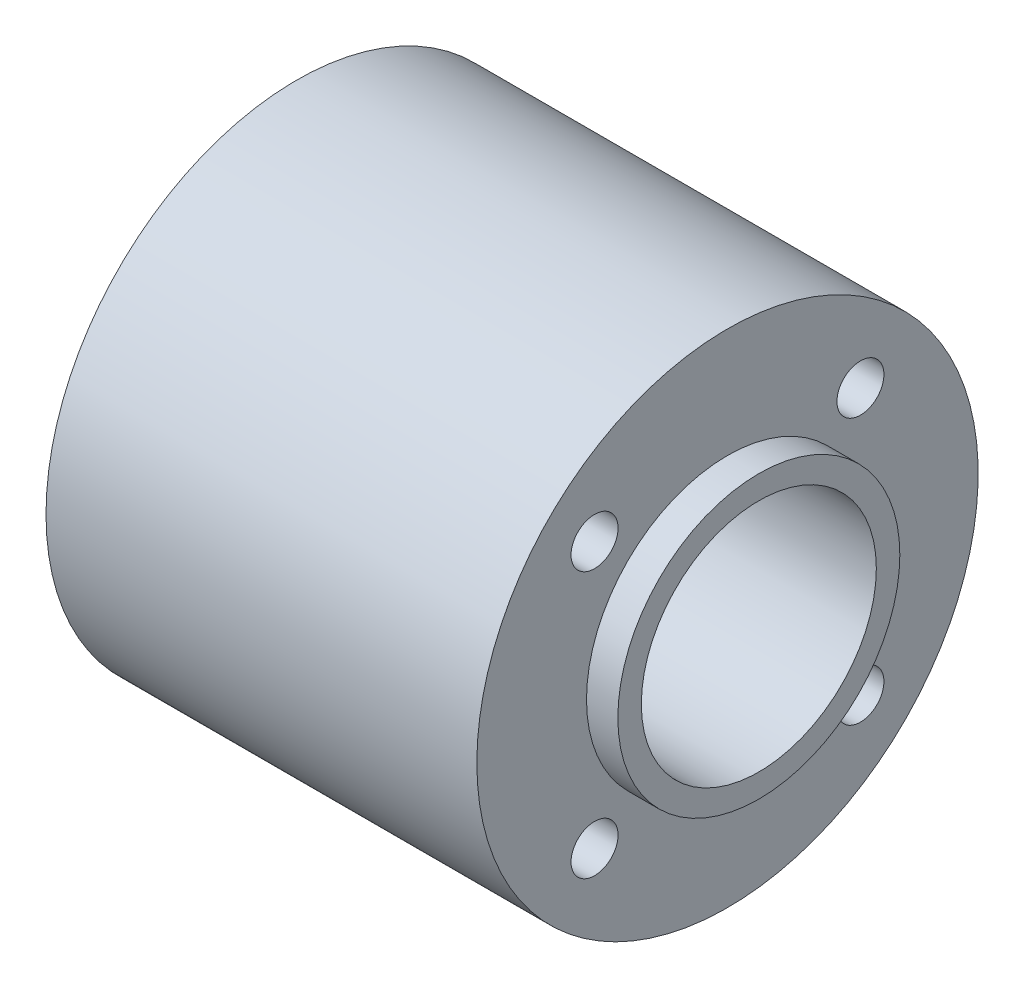
ISO-10303-21;
HEADER;
FILE_DESCRIPTION(('STEP AP214'),'2;1');
FILE_NAME('part.step','',(''),(''),'','','');
FILE_SCHEMA(('AUTOMOTIVE_DESIGN { 1 0 10303 214 1 1 1 1 }'));
ENDSEC;
DATA;
#1=APPLICATION_CONTEXT('core data for automotive mechanical design processes');
#2=APPLICATION_PROTOCOL_DEFINITION('international standard','automotive_design',2000,#1);
#3=PRODUCT_CONTEXT('',#1,'mechanical');
#4=PRODUCT('Part','Part','',(#3));
#5=PRODUCT_RELATED_PRODUCT_CATEGORY('part','',(#4));
#6=PRODUCT_DEFINITION_FORMATION('','',#4);
#7=PRODUCT_DEFINITION_CONTEXT('part definition',#1,'design');
#8=PRODUCT_DEFINITION('design','',#6,#7);
#9=PRODUCT_DEFINITION_SHAPE('','',#8);
#10=(LENGTH_UNIT() NAMED_UNIT(*) SI_UNIT(.MILLI.,.METRE.));
#11=(NAMED_UNIT(*) PLANE_ANGLE_UNIT() SI_UNIT($,.RADIAN.));
#12=(NAMED_UNIT(*) SI_UNIT($,.STERADIAN.) SOLID_ANGLE_UNIT());
#13=UNCERTAINTY_MEASURE_WITH_UNIT(LENGTH_MEASURE(1.E-05),#10,'distance_accuracy_value','');
#14=(GEOMETRIC_REPRESENTATION_CONTEXT(3) GLOBAL_UNCERTAINTY_ASSIGNED_CONTEXT((#13)) GLOBAL_UNIT_ASSIGNED_CONTEXT((#10,
#11,#12)) REPRESENTATION_CONTEXT('',''));
#15=CARTESIAN_POINT('',(0.,0.,0.));
#16=DIRECTION('',(0.,0.,1.));
#17=DIRECTION('',(1.,0.,0.));
#18=AXIS2_PLACEMENT_3D('',#15,#16,#17);
#19=CARTESIAN_POINT('',(0.,7.5,0.));
#20=DIRECTION('',(1.,0.,0.));
#21=DIRECTION('',(0.,0.,-1.));
#22=AXIS2_PLACEMENT_3D('',#19,#20,#21);
#23=PLANE('',#22);
#24=CARTESIAN_POINT('',(0.,0.,0.));
#25=DIRECTION('',(-1.,0.,0.));
#26=DIRECTION('',(0.,0.,1.));
#27=AXIS2_PLACEMENT_3D('',#24,#25,#26);
#28=CIRCLE('',#27,7.5);
#29=CARTESIAN_POINT('',(0.,0.,7.5));
#30=VERTEX_POINT('',#29);
#31=EDGE_CURVE('E68',#30,#30,#28,.T.);
#32=ORIENTED_EDGE('',*,*,#31,.F.);
#33=EDGE_LOOP('',(#32));
#34=FACE_BOUND('',#33,.T.);
#35=CARTESIAN_POINT('',(0.,0.,0.));
#36=DIRECTION('',(-1.,0.,0.));
#37=DIRECTION('',(0.,0.,1.));
#38=AXIS2_PLACEMENT_3D('',#35,#36,#37);
#39=CIRCLE('',#38,9.00000000000084);
#40=CARTESIAN_POINT('',(0.,0.,9.00000000000084));
#41=VERTEX_POINT('',#40);
#42=EDGE_CURVE('E10',#41,#41,#39,.T.);
#43=ORIENTED_EDGE('',*,*,#42,.T.);
#44=EDGE_LOOP('',(#43));
#45=FACE_BOUND('',#44,.T.);
#46=ADVANCED_FACE('F41',(#34,#45),#23,.F.);
#47=CARTESIAN_POINT('',(0.,0.,0.));
#48=DIRECTION('',(-1.,0.,0.));
#49=DIRECTION('',(0.,0.,1.));
#50=AXIS2_PLACEMENT_3D('',#47,#48,#49);
#51=CYLINDRICAL_SURFACE('',#50,9.00000000000042);
#52=ORIENTED_EDGE('',*,*,#42,.F.);
#53=EDGE_LOOP('',(#52));
#54=FACE_BOUND('',#53,.T.);
#55=CARTESIAN_POINT('',(2.,0.,0.));
#56=DIRECTION('',(-1.,0.,0.));
#57=DIRECTION('',(0.,0.,1.));
#58=AXIS2_PLACEMENT_3D('',#55,#56,#57);
#59=CIRCLE('',#58,9.);
#60=CARTESIAN_POINT('',(2.,0.,9.));
#61=VERTEX_POINT('',#60);
#62=EDGE_CURVE('E48',#61,#61,#59,.T.);
#63=ORIENTED_EDGE('',*,*,#62,.T.);
#64=EDGE_LOOP('',(#63));
#65=FACE_BOUND('',#64,.T.);
#66=ADVANCED_FACE('F130',(#54,#65),#51,.T.);
#67=CARTESIAN_POINT('',(2.,9.,0.));
#68=DIRECTION('',(1.,0.,0.));
#69=DIRECTION('',(0.,0.,-1.));
#70=AXIS2_PLACEMENT_3D('',#67,#68,#69);
#71=PLANE('',#70);
#72=CARTESIAN_POINT('',(2.,-8.4852813742385,-8.48528137423864));
#73=DIRECTION('',(-1.,0.,0.));
#74=DIRECTION('',(0.,0.,1.));
#75=AXIS2_PLACEMENT_3D('',#72,#73,#74);
#76=CIRCLE('',#75,1.5);
#77=CARTESIAN_POINT('',(2.,-8.4852813742385,-6.98528137423864));
#78=VERTEX_POINT('',#77);
#79=EDGE_CURVE('E148',#78,#78,#76,.T.);
#80=ORIENTED_EDGE('',*,*,#79,.F.);
#81=EDGE_LOOP('',(#80));
#82=FACE_BOUND('',#81,.T.);
#83=CARTESIAN_POINT('',(2.,-8.48528137423861,8.48528137423853));
#84=DIRECTION('',(-1.,0.,0.));
#85=DIRECTION('',(0.,0.,1.));
#86=AXIS2_PLACEMENT_3D('',#83,#84,#85);
#87=CIRCLE('',#86,1.5);
#88=CARTESIAN_POINT('',(2.,-8.48528137423861,9.98528137423853));
#89=VERTEX_POINT('',#88);
#90=EDGE_CURVE('E152',#89,#89,#87,.T.);
#91=ORIENTED_EDGE('',*,*,#90,.F.);
#92=EDGE_LOOP('',(#91));
#93=FACE_BOUND('',#92,.T.);
#94=CARTESIAN_POINT('',(2.,8.48528137423856,8.48528137423858));
#95=DIRECTION('',(-1.,0.,0.));
#96=DIRECTION('',(0.,0.,1.));
#97=AXIS2_PLACEMENT_3D('',#94,#95,#96);
#98=CIRCLE('',#97,1.5);
#99=CARTESIAN_POINT('',(2.,8.48528137423856,9.98528137423858));
#100=VERTEX_POINT('',#99);
#101=EDGE_CURVE('E156',#100,#100,#98,.T.);
#102=ORIENTED_EDGE('',*,*,#101,.F.);
#103=EDGE_LOOP('',(#102));
#104=FACE_BOUND('',#103,.T.);
#105=CARTESIAN_POINT('',(2.,8.48528137423855,-8.48528137423859));
#106=DIRECTION('',(-1.,0.,0.));
#107=DIRECTION('',(0.,0.,1.));
#108=AXIS2_PLACEMENT_3D('',#105,#106,#107);
#109=CIRCLE('',#108,1.5);
#110=CARTESIAN_POINT('',(2.,8.48528137423855,-6.98528137423859));
#111=VERTEX_POINT('',#110);
#112=EDGE_CURVE('E61',#111,#111,#109,.T.);
#113=ORIENTED_EDGE('',*,*,#112,.F.);
#114=EDGE_LOOP('',(#113));
#115=FACE_BOUND('',#114,.T.);
#116=ORIENTED_EDGE('',*,*,#62,.F.);
#117=EDGE_LOOP('',(#116));
#118=FACE_BOUND('',#117,.T.);
#119=CARTESIAN_POINT('',(2.,0.,0.));
#120=DIRECTION('',(-1.,0.,0.));
#121=DIRECTION('',(0.,0.,1.));
#122=AXIS2_PLACEMENT_3D('',#119,#120,#121);
#123=CIRCLE('',#122,16.);
#124=CARTESIAN_POINT('',(2.,0.,16.));
#125=VERTEX_POINT('',#124);
#126=EDGE_CURVE('E53',#125,#125,#123,.T.);
#127=ORIENTED_EDGE('',*,*,#126,.T.);
#128=EDGE_LOOP('',(#127));
#129=FACE_BOUND('',#128,.T.);
#130=ADVANCED_FACE('F92',(#82,#93,#104,#115,#118,#129),#71,.F.);
#131=CARTESIAN_POINT('',(0.,0.,0.));
#132=DIRECTION('',(-1.,0.,0.));
#133=DIRECTION('',(0.,0.,1.));
#134=AXIS2_PLACEMENT_3D('',#131,#132,#133);
#135=CYLINDRICAL_SURFACE('',#134,16.);
#136=ORIENTED_EDGE('',*,*,#126,.F.);
#137=EDGE_LOOP('',(#136));
#138=FACE_BOUND('',#137,.T.);
#139=CARTESIAN_POINT('',(29.5,0.,0.));
#140=DIRECTION('',(-1.,0.,0.));
#141=DIRECTION('',(0.,0.,1.));
#142=AXIS2_PLACEMENT_3D('',#139,#140,#141);
#143=CIRCLE('',#142,16.);
#144=CARTESIAN_POINT('',(29.5,0.,16.));
#145=VERTEX_POINT('',#144);
#146=EDGE_CURVE('E87',#145,#145,#143,.T.);
#147=ORIENTED_EDGE('',*,*,#146,.T.);
#148=EDGE_LOOP('',(#147));
#149=FACE_BOUND('',#148,.T.);
#150=ADVANCED_FACE('F94',(#138,#149),#135,.T.);
#151=CARTESIAN_POINT('',(29.5,16.,0.));
#152=DIRECTION('',(-1.,0.,0.));
#153=DIRECTION('',(0.,0.,1.));
#154=AXIS2_PLACEMENT_3D('',#151,#152,#153);
#155=PLANE('',#154);
#156=CARTESIAN_POINT('',(29.5,-8.4852813742385,-8.48528137423864));
#157=DIRECTION('',(-1.,0.,0.));
#158=DIRECTION('',(0.,0.,1.));
#159=AXIS2_PLACEMENT_3D('',#156,#157,#158);
#160=CIRCLE('',#159,1.5);
#161=CARTESIAN_POINT('',(29.5,-8.4852813742385,-6.98528137423864));
#162=VERTEX_POINT('',#161);
#163=EDGE_CURVE('E44',#162,#162,#160,.T.);
#164=ORIENTED_EDGE('',*,*,#163,.T.);
#165=EDGE_LOOP('',(#164));
#166=FACE_BOUND('',#165,.T.);
#167=CARTESIAN_POINT('',(29.5,-8.48528137423861,8.48528137423853));
#168=DIRECTION('',(-1.,0.,0.));
#169=DIRECTION('',(0.,0.,1.));
#170=AXIS2_PLACEMENT_3D('',#167,#168,#169);
#171=CIRCLE('',#170,1.5);
#172=CARTESIAN_POINT('',(29.5,-8.48528137423861,9.98528137423853));
#173=VERTEX_POINT('',#172);
#174=EDGE_CURVE('E63',#173,#173,#171,.T.);
#175=ORIENTED_EDGE('',*,*,#174,.T.);
#176=EDGE_LOOP('',(#175));
#177=FACE_BOUND('',#176,.T.);
#178=CARTESIAN_POINT('',(29.5,8.48528137423856,8.48528137423858));
#179=DIRECTION('',(-1.,0.,0.));
#180=DIRECTION('',(0.,0.,1.));
#181=AXIS2_PLACEMENT_3D('',#178,#179,#180);
#182=CIRCLE('',#181,1.5);
#183=CARTESIAN_POINT('',(29.5,8.48528137423856,9.98528137423858));
#184=VERTEX_POINT('',#183);
#185=EDGE_CURVE('E60',#184,#184,#182,.T.);
#186=ORIENTED_EDGE('',*,*,#185,.T.);
#187=EDGE_LOOP('',(#186));
#188=FACE_BOUND('',#187,.T.);
#189=CARTESIAN_POINT('',(29.5,8.48528137423855,-8.48528137423859));
#190=DIRECTION('',(-1.,0.,0.));
#191=DIRECTION('',(0.,0.,1.));
#192=AXIS2_PLACEMENT_3D('',#189,#190,#191);
#193=CIRCLE('',#192,1.5);
#194=CARTESIAN_POINT('',(29.5,8.48528137423855,-6.98528137423859));
#195=VERTEX_POINT('',#194);
#196=EDGE_CURVE('E57',#195,#195,#193,.T.);
#197=ORIENTED_EDGE('',*,*,#196,.T.);
#198=EDGE_LOOP('',(#197));
#199=FACE_BOUND('',#198,.T.);
#200=ORIENTED_EDGE('',*,*,#146,.F.);
#201=EDGE_LOOP('',(#200));
#202=FACE_BOUND('',#201,.T.);
#203=CARTESIAN_POINT('',(29.5,0.,0.));
#204=DIRECTION('',(-1.,0.,0.));
#205=DIRECTION('',(0.,0.,1.));
#206=AXIS2_PLACEMENT_3D('',#203,#204,#205);
#207=CIRCLE('',#206,9.);
#208=CARTESIAN_POINT('',(29.5,0.,9.));
#209=VERTEX_POINT('',#208);
#210=EDGE_CURVE('E84',#209,#209,#207,.T.);
#211=ORIENTED_EDGE('',*,*,#210,.T.);
#212=EDGE_LOOP('',(#211));
#213=FACE_BOUND('',#212,.T.);
#214=ADVANCED_FACE('F97',(#166,#177,#188,#199,#202,#213),#155,.F.);
#215=CARTESIAN_POINT('',(0.,0.,0.));
#216=DIRECTION('',(-1.,0.,0.));
#217=DIRECTION('',(0.,0.,1.));
#218=AXIS2_PLACEMENT_3D('',#215,#216,#217);
#219=CYLINDRICAL_SURFACE('',#218,9.);
#220=ORIENTED_EDGE('',*,*,#210,.F.);
#221=EDGE_LOOP('',(#220));
#222=FACE_BOUND('',#221,.T.);
#223=CARTESIAN_POINT('',(31.5,0.,0.));
#224=DIRECTION('',(-1.,0.,0.));
#225=DIRECTION('',(0.,0.,1.));
#226=AXIS2_PLACEMENT_3D('',#223,#224,#225);
#227=CIRCLE('',#226,9.);
#228=CARTESIAN_POINT('',(31.5,0.,9.));
#229=VERTEX_POINT('',#228);
#230=EDGE_CURVE('E77',#229,#229,#227,.T.);
#231=ORIENTED_EDGE('',*,*,#230,.T.);
#232=EDGE_LOOP('',(#231));
#233=FACE_BOUND('',#232,.T.);
#234=ADVANCED_FACE('F103',(#222,#233),#219,.T.);
#235=CARTESIAN_POINT('',(31.5,9.,0.));
#236=DIRECTION('',(-1.,0.,0.));
#237=DIRECTION('',(0.,0.,1.));
#238=AXIS2_PLACEMENT_3D('',#235,#236,#237);
#239=PLANE('',#238);
#240=ORIENTED_EDGE('',*,*,#230,.F.);
#241=EDGE_LOOP('',(#240));
#242=FACE_BOUND('',#241,.T.);
#243=CARTESIAN_POINT('',(31.5,0.,0.));
#244=DIRECTION('',(-1.,0.,0.));
#245=DIRECTION('',(0.,0.,1.));
#246=AXIS2_PLACEMENT_3D('',#243,#244,#245);
#247=CIRCLE('',#246,7.5);
#248=CARTESIAN_POINT('',(31.5,0.,7.5));
#249=VERTEX_POINT('',#248);
#250=EDGE_CURVE('E72',#249,#249,#247,.T.);
#251=ORIENTED_EDGE('',*,*,#250,.T.);
#252=EDGE_LOOP('',(#251));
#253=FACE_BOUND('',#252,.T.);
#254=ADVANCED_FACE('F109',(#242,#253),#239,.F.);
#255=CARTESIAN_POINT('',(0.,0.,0.));
#256=DIRECTION('',(-1.,0.,0.));
#257=DIRECTION('',(0.,0.,1.));
#258=AXIS2_PLACEMENT_3D('',#255,#256,#257);
#259=CYLINDRICAL_SURFACE('',#258,7.5);
#260=ORIENTED_EDGE('',*,*,#250,.F.);
#261=EDGE_LOOP('',(#260));
#262=FACE_BOUND('',#261,.T.);
#263=ORIENTED_EDGE('',*,*,#31,.T.);
#264=EDGE_LOOP('',(#263));
#265=FACE_BOUND('',#264,.T.);
#266=ADVANCED_FACE('F115',(#262,#265),#259,.F.);
#267=CARTESIAN_POINT('',(31.5,8.48528137423855,-8.48528137423859));
#268=DIRECTION('',(-1.,0.,0.));
#269=DIRECTION('',(0.,0.,1.));
#270=AXIS2_PLACEMENT_3D('',#267,#268,#269);
#271=CYLINDRICAL_SURFACE('',#270,1.5);
#272=ORIENTED_EDGE('',*,*,#112,.T.);
#273=EDGE_LOOP('',(#272));
#274=FACE_BOUND('',#273,.T.);
#275=ORIENTED_EDGE('',*,*,#196,.F.);
#276=EDGE_LOOP('',(#275));
#277=FACE_BOUND('',#276,.T.);
#278=ADVANCED_FACE('F120',(#274,#277),#271,.F.);
#279=CARTESIAN_POINT('',(31.5,8.48528137423856,8.48528137423858));
#280=DIRECTION('',(-1.,0.,0.));
#281=DIRECTION('',(0.,0.,1.));
#282=AXIS2_PLACEMENT_3D('',#279,#280,#281);
#283=CYLINDRICAL_SURFACE('',#282,1.5);
#284=ORIENTED_EDGE('',*,*,#101,.T.);
#285=EDGE_LOOP('',(#284));
#286=FACE_BOUND('',#285,.T.);
#287=ORIENTED_EDGE('',*,*,#185,.F.);
#288=EDGE_LOOP('',(#287));
#289=FACE_BOUND('',#288,.T.);
#290=ADVANCED_FACE('F126',(#286,#289),#283,.F.);
#291=CARTESIAN_POINT('',(31.5,-8.48528137423861,8.48528137423853));
#292=DIRECTION('',(-1.,0.,0.));
#293=DIRECTION('',(0.,0.,1.));
#294=AXIS2_PLACEMENT_3D('',#291,#292,#293);
#295=CYLINDRICAL_SURFACE('',#294,1.5);
#296=ORIENTED_EDGE('',*,*,#90,.T.);
#297=EDGE_LOOP('',(#296));
#298=FACE_BOUND('',#297,.T.);
#299=ORIENTED_EDGE('',*,*,#174,.F.);
#300=EDGE_LOOP('',(#299));
#301=FACE_BOUND('',#300,.T.);
#302=ADVANCED_FACE('F166',(#298,#301),#295,.F.);
#303=CARTESIAN_POINT('',(31.5,-8.4852813742385,-8.48528137423864));
#304=DIRECTION('',(-1.,0.,0.));
#305=DIRECTION('',(0.,0.,1.));
#306=AXIS2_PLACEMENT_3D('',#303,#304,#305);
#307=CYLINDRICAL_SURFACE('',#306,1.5);
#308=ORIENTED_EDGE('',*,*,#79,.T.);
#309=EDGE_LOOP('',(#308));
#310=FACE_BOUND('',#309,.T.);
#311=ORIENTED_EDGE('',*,*,#163,.F.);
#312=EDGE_LOOP('',(#311));
#313=FACE_BOUND('',#312,.T.);
#314=ADVANCED_FACE('F163',(#310,#313),#307,.F.);
#315=CLOSED_SHELL('',(#46,#66,#130,#150,#214,#234,#254,#266,#278,#290,#302,#314));
#316=MANIFOLD_SOLID_BREP('B2',#315);
#317=ADVANCED_BREP_SHAPE_REPRESENTATION('',(#18,#316),#14);
#318=SHAPE_DEFINITION_REPRESENTATION(#9,#317);
ENDSEC;
END-ISO-10303-21;
